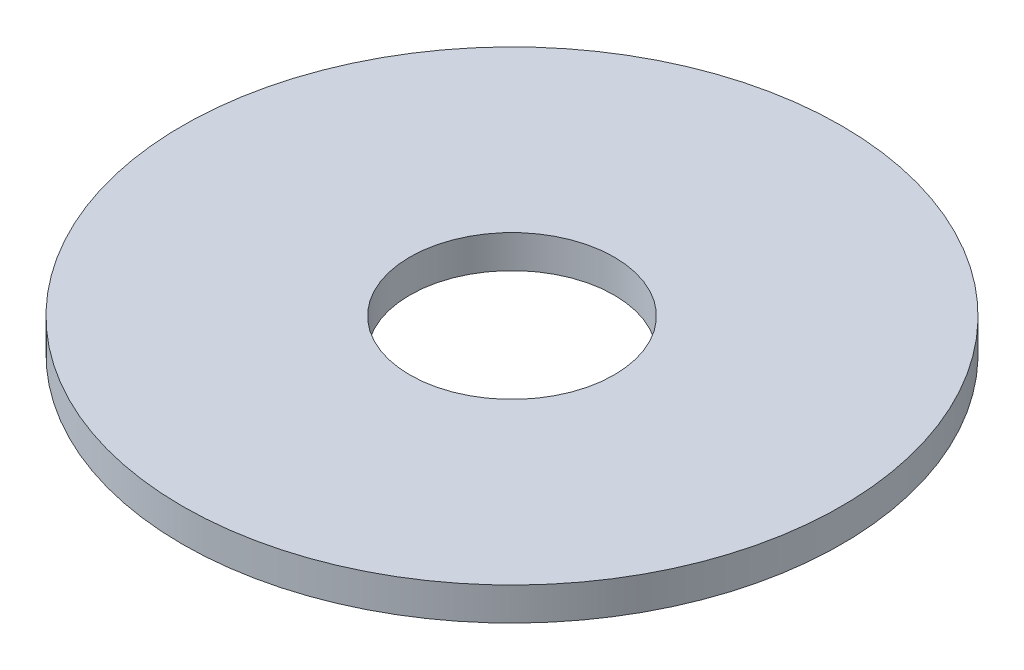
ISO-10303-21;
HEADER;
FILE_DESCRIPTION(('STEP AP214'),'2;1');
FILE_NAME('part.step','',(''),(''),'','','');
FILE_SCHEMA(('AUTOMOTIVE_DESIGN { 1 0 10303 214 1 1 1 1 }'));
ENDSEC;
DATA;
#1=APPLICATION_CONTEXT('core data for automotive mechanical design processes');
#2=APPLICATION_PROTOCOL_DEFINITION('international standard','automotive_design',2000,#1);
#3=PRODUCT_CONTEXT('',#1,'mechanical');
#4=PRODUCT('Part','Part','',(#3));
#5=PRODUCT_RELATED_PRODUCT_CATEGORY('part','',(#4));
#6=PRODUCT_DEFINITION_FORMATION('','',#4);
#7=PRODUCT_DEFINITION_CONTEXT('part definition',#1,'design');
#8=PRODUCT_DEFINITION('design','',#6,#7);
#9=PRODUCT_DEFINITION_SHAPE('','',#8);
#10=(LENGTH_UNIT() NAMED_UNIT(*) SI_UNIT(.MILLI.,.METRE.));
#11=(NAMED_UNIT(*) PLANE_ANGLE_UNIT() SI_UNIT($,.RADIAN.));
#12=(NAMED_UNIT(*) SI_UNIT($,.STERADIAN.) SOLID_ANGLE_UNIT());
#13=UNCERTAINTY_MEASURE_WITH_UNIT(LENGTH_MEASURE(1.E-05),#10,'distance_accuracy_value','');
#14=(GEOMETRIC_REPRESENTATION_CONTEXT(3) GLOBAL_UNCERTAINTY_ASSIGNED_CONTEXT((#13)) GLOBAL_UNIT_ASSIGNED_CONTEXT((#10,
#11,#12)) REPRESENTATION_CONTEXT('',''));
#15=CARTESIAN_POINT('',(0.,0.,0.));
#16=DIRECTION('',(0.,0.,1.));
#17=DIRECTION('',(1.,0.,0.));
#18=AXIS2_PLACEMENT_3D('',#15,#16,#17);
#19=CARTESIAN_POINT('',(0.,1.,0.));
#20=DIRECTION('',(0.,1.,0.));
#21=DIRECTION('',(0.,0.,1.));
#22=AXIS2_PLACEMENT_3D('',#19,#20,#21);
#23=PLANE('',#22);
#24=CARTESIAN_POINT('',(0.,1.,0.));
#25=DIRECTION('',(0.,1.,0.));
#26=DIRECTION('',(0.,0.,1.));
#27=AXIS2_PLACEMENT_3D('',#24,#25,#26);
#28=CIRCLE('',#27,10.);
#29=CARTESIAN_POINT('',(0.,1.,10.));
#30=VERTEX_POINT('',#29);
#31=EDGE_CURVE('E10',#30,#30,#28,.T.);
#32=ORIENTED_EDGE('',*,*,#31,.T.);
#33=EDGE_LOOP('',(#32));
#34=FACE_BOUND('',#33,.T.);
#35=CARTESIAN_POINT('',(0.,1.,0.));
#36=DIRECTION('',(0.,1.,0.));
#37=DIRECTION('',(0.,0.,1.));
#38=AXIS2_PLACEMENT_3D('',#35,#36,#37);
#39=CIRCLE('',#38,3.1);
#40=CARTESIAN_POINT('',(0.,1.,3.1));
#41=VERTEX_POINT('',#40);
#42=EDGE_CURVE('E48',#41,#41,#39,.T.);
#43=ORIENTED_EDGE('',*,*,#42,.F.);
#44=EDGE_LOOP('',(#43));
#45=FACE_BOUND('',#44,.T.);
#46=ADVANCED_FACE('F37',(#34,#45),#23,.T.);
#47=CARTESIAN_POINT('',(0.,0.,0.));
#48=DIRECTION('',(0.,1.,0.));
#49=DIRECTION('',(0.,0.,1.));
#50=AXIS2_PLACEMENT_3D('',#47,#48,#49);
#51=PLANE('',#50);
#52=CARTESIAN_POINT('',(0.,0.,0.));
#53=DIRECTION('',(0.,1.,0.));
#54=DIRECTION('',(0.,0.,1.));
#55=AXIS2_PLACEMENT_3D('',#52,#53,#54);
#56=CIRCLE('',#55,10.);
#57=CARTESIAN_POINT('',(0.,0.,10.));
#58=VERTEX_POINT('',#57);
#59=EDGE_CURVE('E41',#58,#58,#56,.T.);
#60=ORIENTED_EDGE('',*,*,#59,.F.);
#61=EDGE_LOOP('',(#60));
#62=FACE_BOUND('',#61,.T.);
#63=CARTESIAN_POINT('',(0.,0.,0.));
#64=DIRECTION('',(0.,1.,0.));
#65=DIRECTION('',(0.,0.,1.));
#66=AXIS2_PLACEMENT_3D('',#63,#64,#65);
#67=CIRCLE('',#66,3.1);
#68=CARTESIAN_POINT('',(0.,0.,3.1));
#69=VERTEX_POINT('',#68);
#70=EDGE_CURVE('E50',#69,#69,#67,.T.);
#71=ORIENTED_EDGE('',*,*,#70,.T.);
#72=EDGE_LOOP('',(#71));
#73=FACE_BOUND('',#72,.T.);
#74=ADVANCED_FACE('F60',(#62,#73),#51,.F.);
#75=CARTESIAN_POINT('',(0.,1.,0.));
#76=DIRECTION('',(0.,-1.,0.));
#77=DIRECTION('',(0.,0.,-1.));
#78=AXIS2_PLACEMENT_3D('',#75,#76,#77);
#79=CYLINDRICAL_SURFACE('',#78,10.);
#80=ORIENTED_EDGE('',*,*,#31,.F.);
#81=EDGE_LOOP('',(#80));
#82=FACE_BOUND('',#81,.T.);
#83=ORIENTED_EDGE('',*,*,#59,.T.);
#84=EDGE_LOOP('',(#83));
#85=FACE_BOUND('',#84,.T.);
#86=ADVANCED_FACE('F39',(#82,#85),#79,.T.);
#87=CARTESIAN_POINT('',(0.,1.,0.));
#88=DIRECTION('',(0.,-1.,0.));
#89=DIRECTION('',(0.,0.,-1.));
#90=AXIS2_PLACEMENT_3D('',#87,#88,#89);
#91=CYLINDRICAL_SURFACE('',#90,3.1);
#92=ORIENTED_EDGE('',*,*,#42,.T.);
#93=EDGE_LOOP('',(#92));
#94=FACE_BOUND('',#93,.T.);
#95=ORIENTED_EDGE('',*,*,#70,.F.);
#96=EDGE_LOOP('',(#95));
#97=FACE_BOUND('',#96,.T.);
#98=ADVANCED_FACE('F56',(#94,#97),#91,.F.);
#99=CLOSED_SHELL('',(#46,#74,#86,#98));
#100=MANIFOLD_SOLID_BREP('B2',#99);
#101=ADVANCED_BREP_SHAPE_REPRESENTATION('',(#18,#100),#14);
#102=SHAPE_DEFINITION_REPRESENTATION(#9,#101);
ENDSEC;
END-ISO-10303-21;
